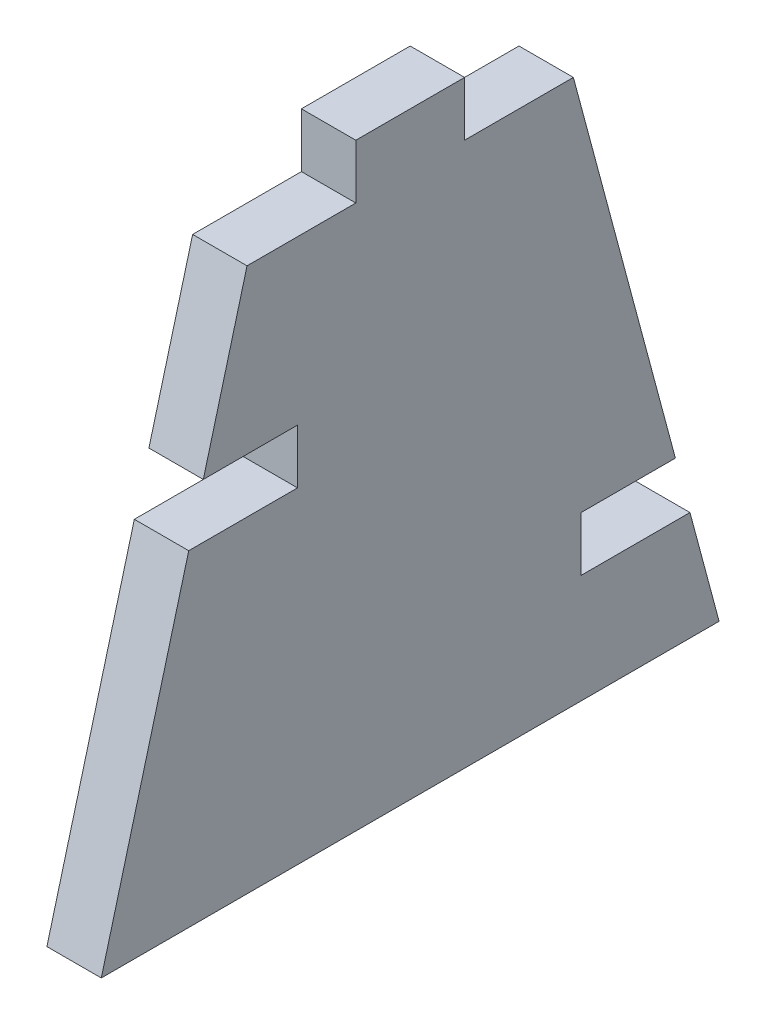
ISO-10303-21;
HEADER;
FILE_DESCRIPTION(('STEP AP214'),'2;1');
FILE_NAME('part.step','',(''),(''),'','','');
FILE_SCHEMA(('AUTOMOTIVE_DESIGN { 1 0 10303 214 1 1 1 1 }'));
ENDSEC;
DATA;
#1=APPLICATION_CONTEXT('core data for automotive mechanical design processes');
#2=APPLICATION_PROTOCOL_DEFINITION('international standard','automotive_design',2000,#1);
#3=PRODUCT_CONTEXT('',#1,'mechanical');
#4=PRODUCT('Part','Part','',(#3));
#5=PRODUCT_RELATED_PRODUCT_CATEGORY('part','',(#4));
#6=PRODUCT_DEFINITION_FORMATION('','',#4);
#7=PRODUCT_DEFINITION_CONTEXT('part definition',#1,'design');
#8=PRODUCT_DEFINITION('design','',#6,#7);
#9=PRODUCT_DEFINITION_SHAPE('','',#8);
#10=(LENGTH_UNIT() NAMED_UNIT(*) SI_UNIT(.MILLI.,.METRE.));
#11=(NAMED_UNIT(*) PLANE_ANGLE_UNIT() SI_UNIT($,.RADIAN.));
#12=(NAMED_UNIT(*) SI_UNIT($,.STERADIAN.) SOLID_ANGLE_UNIT());
#13=UNCERTAINTY_MEASURE_WITH_UNIT(LENGTH_MEASURE(1.E-05),#10,'distance_accuracy_value','');
#14=(GEOMETRIC_REPRESENTATION_CONTEXT(3) GLOBAL_UNCERTAINTY_ASSIGNED_CONTEXT((#13)) GLOBAL_UNIT_ASSIGNED_CONTEXT((#10,
#11,#12)) REPRESENTATION_CONTEXT('',''));
#15=CARTESIAN_POINT('',(0.,0.,0.));
#16=DIRECTION('',(0.,0.,1.));
#17=DIRECTION('',(1.,0.,0.));
#18=AXIS2_PLACEMENT_3D('',#15,#16,#17);
#19=CARTESIAN_POINT('',(10.,70.,20.7179676972451));
#20=DIRECTION('',(0.,0.,-1.));
#21=DIRECTION('',(0.,1.,0.));
#22=AXIS2_PLACEMENT_3D('',#19,#20,#21);
#23=PLANE('',#22);
#24=DIRECTION('',(0.,-1.,0.));
#25=VECTOR('',#24,1.);
#26=CARTESIAN_POINT('',(0.,70.,20.7179676972451));
#27=LINE('',#26,#25);
#28=CARTESIAN_POINT('',(0.,70.,20.7179676972451));
#29=VERTEX_POINT('',#28);
#30=CARTESIAN_POINT('',(0.,60.,20.7179676972451));
#31=VERTEX_POINT('',#30);
#32=EDGE_CURVE('E175',#29,#31,#27,.T.);
#33=ORIENTED_EDGE('',*,*,#32,.T.);
#34=DIRECTION('',(-1.,0.,0.));
#35=VECTOR('',#34,1.);
#36=CARTESIAN_POINT('',(10.,60.,20.7179676972451));
#37=LINE('',#36,#35);
#38=CARTESIAN_POINT('',(10.,60.,20.7179676972451));
#39=VERTEX_POINT('',#38);
#40=EDGE_CURVE('E11',#39,#31,#37,.T.);
#41=ORIENTED_EDGE('',*,*,#40,.F.);
#42=DIRECTION('',(0.,-1.,0.));
#43=VECTOR('',#42,1.);
#44=CARTESIAN_POINT('',(10.,70.,20.7179676972451));
#45=LINE('',#44,#43);
#46=CARTESIAN_POINT('',(10.,70.,20.7179676972451));
#47=VERTEX_POINT('',#46);
#48=EDGE_CURVE('E216',#47,#39,#45,.T.);
#49=ORIENTED_EDGE('',*,*,#48,.F.);
#50=DIRECTION('',(-1.,0.,0.));
#51=VECTOR('',#50,1.);
#52=CARTESIAN_POINT('',(10.,70.,20.7179676972451));
#53=LINE('',#52,#51);
#54=EDGE_CURVE('E171',#47,#29,#53,.T.);
#55=ORIENTED_EDGE('',*,*,#54,.T.);
#56=EDGE_LOOP('',(#33,#41,#49,#55));
#57=FACE_BOUND('',#56,.T.);
#58=ADVANCED_FACE('F32',(#57),#23,.F.);
#59=CARTESIAN_POINT('',(10.,60.,20.7179676972451));
#60=DIRECTION('',(0.,-1.,0.));
#61=DIRECTION('',(0.,0.,-1.));
#62=AXIS2_PLACEMENT_3D('',#59,#60,#61);
#63=PLANE('',#62);
#64=DIRECTION('',(0.,0.,1.));
#65=VECTOR('',#64,1.);
#66=CARTESIAN_POINT('',(0.,60.,20.7179676972451));
#67=LINE('',#66,#65);
#68=CARTESIAN_POINT('',(0.,60.,40.7179676972451));
#69=VERTEX_POINT('',#68);
#70=EDGE_CURVE('E178',#31,#69,#67,.T.);
#71=ORIENTED_EDGE('',*,*,#70,.T.);
#72=DIRECTION('',(-1.,0.,0.));
#73=VECTOR('',#72,1.);
#74=CARTESIAN_POINT('',(10.,60.,40.7179676972451));
#75=LINE('',#74,#73);
#76=CARTESIAN_POINT('',(10.,60.,40.7179676972451));
#77=VERTEX_POINT('',#76);
#78=EDGE_CURVE('E40',#77,#69,#75,.T.);
#79=ORIENTED_EDGE('',*,*,#78,.F.);
#80=DIRECTION('',(0.,0.,1.));
#81=VECTOR('',#80,1.);
#82=CARTESIAN_POINT('',(10.,60.,20.7179676972451));
#83=LINE('',#82,#81);
#84=EDGE_CURVE('E111',#39,#77,#83,.T.);
#85=ORIENTED_EDGE('',*,*,#84,.F.);
#86=ORIENTED_EDGE('',*,*,#40,.T.);
#87=EDGE_LOOP('',(#71,#79,#85,#86));
#88=FACE_BOUND('',#87,.T.);
#89=ADVANCED_FACE('F248',(#88),#63,.F.);
#90=CARTESIAN_POINT('',(10.,0.,56.7949192431127));
#91=DIRECTION('',(0.,0.258819045102525,0.965925826289067));
#92=DIRECTION('',(0.,-0.965925826289067,0.258819045102525));
#93=AXIS2_PLACEMENT_3D('',#90,#91,#92);
#94=PLANE('',#93);
#95=DIRECTION('',(0.,0.965925826289067,-0.258819045102525));
#96=VECTOR('',#95,1.);
#97=CARTESIAN_POINT('',(0.,0.,56.7949192431127));
#98=LINE('',#97,#96);
#99=CARTESIAN_POINT('',(0.,0.,56.7949192431127));
#100=VERTEX_POINT('',#99);
#101=EDGE_CURVE('E181',#100,#69,#98,.T.);
#102=ORIENTED_EDGE('',*,*,#101,.F.);
#103=DIRECTION('',(-1.,0.,0.));
#104=VECTOR('',#103,1.);
#105=CARTESIAN_POINT('',(10.,0.,56.7949192431127));
#106=LINE('',#105,#104);
#107=CARTESIAN_POINT('',(10.,0.,56.7949192431127));
#108=VERTEX_POINT('',#107);
#109=EDGE_CURVE('E241',#108,#100,#106,.T.);
#110=ORIENTED_EDGE('',*,*,#109,.F.);
#111=DIRECTION('',(0.,0.965925826289067,-0.258819045102525));
#112=VECTOR('',#111,1.);
#113=CARTESIAN_POINT('',(10.,0.,56.7949192431127));
#114=LINE('',#113,#112);
#115=EDGE_CURVE('E247',#108,#77,#114,.T.);
#116=ORIENTED_EDGE('',*,*,#115,.T.);
#117=ORIENTED_EDGE('',*,*,#78,.T.);
#118=EDGE_LOOP('',(#102,#110,#116,#117));
#119=FACE_BOUND('',#118,.T.);
#120=ADVANCED_FACE('F245',(#119),#94,.T.);
#121=CARTESIAN_POINT('',(10.,0.,-56.7949192431127));
#122=DIRECTION('',(0.,-1.,0.));
#123=DIRECTION('',(0.,0.,-1.));
#124=AXIS2_PLACEMENT_3D('',#121,#122,#123);
#125=PLANE('',#124);
#126=DIRECTION('',(0.,0.,1.));
#127=VECTOR('',#126,1.);
#128=CARTESIAN_POINT('',(0.,0.,-56.7949192431127));
#129=LINE('',#128,#127);
#130=CARTESIAN_POINT('',(0.,0.,-56.7949192431127));
#131=VERTEX_POINT('',#130);
#132=EDGE_CURVE('E184',#131,#100,#129,.T.);
#133=ORIENTED_EDGE('',*,*,#132,.F.);
#134=DIRECTION('',(-1.,0.,0.));
#135=VECTOR('',#134,1.);
#136=CARTESIAN_POINT('',(10.,0.,-56.7949192431127));
#137=LINE('',#136,#135);
#138=CARTESIAN_POINT('',(10.,0.,-56.7949192431127));
#139=VERTEX_POINT('',#138);
#140=EDGE_CURVE('E239',#139,#131,#137,.T.);
#141=ORIENTED_EDGE('',*,*,#140,.F.);
#142=DIRECTION('',(0.,0.,1.));
#143=VECTOR('',#142,1.);
#144=CARTESIAN_POINT('',(10.,0.,-56.7949192431127));
#145=LINE('',#144,#143);
#146=EDGE_CURVE('E260',#139,#108,#145,.T.);
#147=ORIENTED_EDGE('',*,*,#146,.T.);
#148=ORIENTED_EDGE('',*,*,#109,.T.);
#149=EDGE_LOOP('',(#133,#141,#147,#148));
#150=FACE_BOUND('',#149,.T.);
#151=ADVANCED_FACE('F256',(#150),#125,.T.);
#152=CARTESIAN_POINT('',(10.,0.,-56.7949192431127));
#153=DIRECTION('',(0.,-0.258819045102525,0.965925826289067));
#154=DIRECTION('',(0.,-0.965925826289067,-0.258819045102525));
#155=AXIS2_PLACEMENT_3D('',#152,#153,#154);
#156=PLANE('',#155);
#157=DIRECTION('',(0.,0.965925826289067,0.258819045102525));
#158=VECTOR('',#157,1.);
#159=CARTESIAN_POINT('',(0.,0.,-56.7949192431127));
#160=LINE('',#159,#158);
#161=CARTESIAN_POINT('',(0.,20.,-51.4359353944902));
#162=VERTEX_POINT('',#161);
#163=EDGE_CURVE('E187',#131,#162,#160,.T.);
#164=ORIENTED_EDGE('',*,*,#163,.T.);
#165=DIRECTION('',(-1.,0.,0.));
#166=VECTOR('',#165,1.);
#167=CARTESIAN_POINT('',(10.,20.,-51.4359353944902));
#168=LINE('',#167,#166);
#169=CARTESIAN_POINT('',(10.,20.,-51.4359353944902));
#170=VERTEX_POINT('',#169);
#171=EDGE_CURVE('E237',#170,#162,#168,.T.);
#172=ORIENTED_EDGE('',*,*,#171,.F.);
#173=DIRECTION('',(0.,0.965925826289067,0.258819045102525));
#174=VECTOR('',#173,1.);
#175=CARTESIAN_POINT('',(10.,0.,-56.7949192431127));
#176=LINE('',#175,#174);
#177=EDGE_CURVE('E262',#139,#170,#176,.T.);
#178=ORIENTED_EDGE('',*,*,#177,.F.);
#179=ORIENTED_EDGE('',*,*,#140,.T.);
#180=EDGE_LOOP('',(#164,#172,#178,#179));
#181=FACE_BOUND('',#180,.T.);
#182=ADVANCED_FACE('F312',(#181),#156,.F.);
#183=CARTESIAN_POINT('',(10.,20.,-31.4359353944902));
#184=DIRECTION('',(0.,1.,0.));
#185=DIRECTION('',(0.,0.,1.));
#186=AXIS2_PLACEMENT_3D('',#183,#184,#185);
#187=PLANE('',#186);
#188=DIRECTION('',(0.,0.,-1.));
#189=VECTOR('',#188,1.);
#190=CARTESIAN_POINT('',(0.,20.,-31.4359353944902));
#191=LINE('',#190,#189);
#192=CARTESIAN_POINT('',(0.,20.,-31.4359353944902));
#193=VERTEX_POINT('',#192);
#194=EDGE_CURVE('E190',#193,#162,#191,.T.);
#195=ORIENTED_EDGE('',*,*,#194,.F.);
#196=DIRECTION('',(-1.,0.,0.));
#197=VECTOR('',#196,1.);
#198=CARTESIAN_POINT('',(10.,20.,-31.4359353944902));
#199=LINE('',#198,#197);
#200=CARTESIAN_POINT('',(10.,20.,-31.4359353944902));
#201=VERTEX_POINT('',#200);
#202=EDGE_CURVE('E235',#201,#193,#199,.T.);
#203=ORIENTED_EDGE('',*,*,#202,.F.);
#204=DIRECTION('',(0.,0.,-1.));
#205=VECTOR('',#204,1.);
#206=CARTESIAN_POINT('',(10.,20.,-31.4359353944902));
#207=LINE('',#206,#205);
#208=EDGE_CURVE('E268',#201,#170,#207,.T.);
#209=ORIENTED_EDGE('',*,*,#208,.T.);
#210=ORIENTED_EDGE('',*,*,#171,.T.);
#211=EDGE_LOOP('',(#195,#203,#209,#210));
#212=FACE_BOUND('',#211,.T.);
#213=ADVANCED_FACE('F315',(#212),#187,.T.);
#214=CARTESIAN_POINT('',(10.,30.,-31.4359353944902));
#215=DIRECTION('',(0.,0.,-1.));
#216=DIRECTION('',(-1.,0.,0.));
#217=AXIS2_PLACEMENT_3D('',#214,#215,#216);
#218=PLANE('',#217);
#219=DIRECTION('',(0.,-1.,0.));
#220=VECTOR('',#219,1.);
#221=CARTESIAN_POINT('',(0.,30.,-31.4359353944902));
#222=LINE('',#221,#220);
#223=CARTESIAN_POINT('',(0.,30.,-31.4359353944902));
#224=VERTEX_POINT('',#223);
#225=EDGE_CURVE('E193',#224,#193,#222,.T.);
#226=ORIENTED_EDGE('',*,*,#225,.F.);
#227=DIRECTION('',(-1.,0.,0.));
#228=VECTOR('',#227,1.);
#229=CARTESIAN_POINT('',(10.,30.,-31.4359353944902));
#230=LINE('',#229,#228);
#231=CARTESIAN_POINT('',(10.,30.,-31.4359353944902));
#232=VERTEX_POINT('',#231);
#233=EDGE_CURVE('E233',#232,#224,#230,.T.);
#234=ORIENTED_EDGE('',*,*,#233,.F.);
#235=DIRECTION('',(0.,-1.,0.));
#236=VECTOR('',#235,1.);
#237=CARTESIAN_POINT('',(10.,30.,-31.4359353944902));
#238=LINE('',#237,#236);
#239=EDGE_CURVE('E271',#232,#201,#238,.T.);
#240=ORIENTED_EDGE('',*,*,#239,.T.);
#241=ORIENTED_EDGE('',*,*,#202,.T.);
#242=EDGE_LOOP('',(#226,#234,#240,#241));
#243=FACE_BOUND('',#242,.T.);
#244=ADVANCED_FACE('F319',(#243),#218,.T.);
#245=CARTESIAN_POINT('',(10.,30.,-48.7564434701789));
#246=DIRECTION('',(0.,-1.,0.));
#247=DIRECTION('',(0.,0.,-1.));
#248=AXIS2_PLACEMENT_3D('',#245,#246,#247);
#249=PLANE('',#248);
#250=DIRECTION('',(0.,0.,1.));
#251=VECTOR('',#250,1.);
#252=CARTESIAN_POINT('',(0.,30.,-48.7564434701789));
#253=LINE('',#252,#251);
#254=CARTESIAN_POINT('',(0.,30.,-48.7564434701789));
#255=VERTEX_POINT('',#254);
#256=EDGE_CURVE('E196',#255,#224,#253,.T.);
#257=ORIENTED_EDGE('',*,*,#256,.F.);
#258=DIRECTION('',(-1.,0.,0.));
#259=VECTOR('',#258,1.);
#260=CARTESIAN_POINT('',(10.,30.,-48.7564434701789));
#261=LINE('',#260,#259);
#262=CARTESIAN_POINT('',(10.,30.,-48.7564434701789));
#263=VERTEX_POINT('',#262);
#264=EDGE_CURVE('E230',#263,#255,#261,.T.);
#265=ORIENTED_EDGE('',*,*,#264,.F.);
#266=DIRECTION('',(0.,0.,1.));
#267=VECTOR('',#266,1.);
#268=CARTESIAN_POINT('',(10.,30.,-48.7564434701789));
#269=LINE('',#268,#267);
#270=EDGE_CURVE('E274',#263,#232,#269,.T.);
#271=ORIENTED_EDGE('',*,*,#270,.T.);
#272=ORIENTED_EDGE('',*,*,#233,.T.);
#273=EDGE_LOOP('',(#257,#265,#271,#272));
#274=FACE_BOUND('',#273,.T.);
#275=ADVANCED_FACE('F323',(#274),#249,.T.);
#276=CARTESIAN_POINT('',(10.,70.,-38.0384757729338));
#277=DIRECTION('',(0.,-0.258819045102525,0.965925826289067));
#278=DIRECTION('',(0.,-0.965925826289067,-0.258819045102525));
#279=AXIS2_PLACEMENT_3D('',#276,#277,#278);
#280=PLANE('',#279);
#281=DIRECTION('',(0.,0.965925826289067,0.258819045102525));
#282=VECTOR('',#281,1.);
#283=CARTESIAN_POINT('',(0.,70.,-38.0384757729338));
#284=LINE('',#283,#282);
#285=CARTESIAN_POINT('',(0.,100.,-30.));
#286=VERTEX_POINT('',#285);
#287=EDGE_CURVE('E199',#255,#286,#284,.T.);
#288=ORIENTED_EDGE('',*,*,#287,.T.);
#289=DIRECTION('',(-1.,0.,0.));
#290=VECTOR('',#289,1.);
#291=CARTESIAN_POINT('',(10.,100.,-30.));
#292=LINE('',#291,#290);
#293=CARTESIAN_POINT('',(10.,100.,-30.));
#294=VERTEX_POINT('',#293);
#295=EDGE_CURVE('E227',#294,#286,#292,.T.);
#296=ORIENTED_EDGE('',*,*,#295,.F.);
#297=DIRECTION('',(0.,0.965925826289067,0.258819045102525));
#298=VECTOR('',#297,1.);
#299=CARTESIAN_POINT('',(10.,30.,-48.7564434701789));
#300=LINE('',#299,#298);
#301=EDGE_CURVE('E277',#263,#294,#300,.T.);
#302=ORIENTED_EDGE('',*,*,#301,.F.);
#303=ORIENTED_EDGE('',*,*,#264,.T.);
#304=EDGE_LOOP('',(#288,#296,#302,#303));
#305=FACE_BOUND('',#304,.T.);
#306=ADVANCED_FACE('F327',(#305),#280,.F.);
#307=CARTESIAN_POINT('',(10.,100.,-30.));
#308=DIRECTION('',(0.,-1.,0.));
#309=DIRECTION('',(0.,0.,-1.));
#310=AXIS2_PLACEMENT_3D('',#307,#308,#309);
#311=PLANE('',#310);
#312=DIRECTION('',(0.,0.,1.));
#313=VECTOR('',#312,1.);
#314=CARTESIAN_POINT('',(0.,100.,-30.));
#315=LINE('',#314,#313);
#316=CARTESIAN_POINT('',(0.,100.,-10.));
#317=VERTEX_POINT('',#316);
#318=EDGE_CURVE('E201',#286,#317,#315,.T.);
#319=ORIENTED_EDGE('',*,*,#318,.T.);
#320=DIRECTION('',(-1.,0.,0.));
#321=VECTOR('',#320,1.);
#322=CARTESIAN_POINT('',(10.,100.,-10.));
#323=LINE('',#322,#321);
#324=CARTESIAN_POINT('',(10.,100.,-10.));
#325=VERTEX_POINT('',#324);
#326=EDGE_CURVE('E224',#325,#317,#323,.T.);
#327=ORIENTED_EDGE('',*,*,#326,.F.);
#328=DIRECTION('',(0.,0.,1.));
#329=VECTOR('',#328,1.);
#330=CARTESIAN_POINT('',(10.,100.,-30.));
#331=LINE('',#330,#329);
#332=EDGE_CURVE('E279',#294,#325,#331,.T.);
#333=ORIENTED_EDGE('',*,*,#332,.F.);
#334=ORIENTED_EDGE('',*,*,#295,.T.);
#335=EDGE_LOOP('',(#319,#327,#333,#334));
#336=FACE_BOUND('',#335,.T.);
#337=ADVANCED_FACE('F331',(#336),#311,.F.);
#338=CARTESIAN_POINT('',(10.,100.,-10.));
#339=DIRECTION('',(0.,0.,1.));
#340=DIRECTION('',(0.,-1.,0.));
#341=AXIS2_PLACEMENT_3D('',#338,#339,#340);
#342=PLANE('',#341);
#343=DIRECTION('',(0.,1.,0.));
#344=VECTOR('',#343,1.);
#345=CARTESIAN_POINT('',(0.,100.,-10.));
#346=LINE('',#345,#344);
#347=CARTESIAN_POINT('',(0.,110.,-10.));
#348=VERTEX_POINT('',#347);
#349=EDGE_CURVE('E203',#317,#348,#346,.T.);
#350=ORIENTED_EDGE('',*,*,#349,.T.);
#351=DIRECTION('',(-1.,0.,0.));
#352=VECTOR('',#351,1.);
#353=CARTESIAN_POINT('',(10.,110.,-10.));
#354=LINE('',#353,#352);
#355=CARTESIAN_POINT('',(10.,110.,-10.));
#356=VERTEX_POINT('',#355);
#357=EDGE_CURVE('E222',#356,#348,#354,.T.);
#358=ORIENTED_EDGE('',*,*,#357,.F.);
#359=DIRECTION('',(0.,1.,0.));
#360=VECTOR('',#359,1.);
#361=CARTESIAN_POINT('',(10.,100.,-10.));
#362=LINE('',#361,#360);
#363=EDGE_CURVE('E281',#325,#356,#362,.T.);
#364=ORIENTED_EDGE('',*,*,#363,.F.);
#365=ORIENTED_EDGE('',*,*,#326,.T.);
#366=EDGE_LOOP('',(#350,#358,#364,#365));
#367=FACE_BOUND('',#366,.T.);
#368=ADVANCED_FACE('F335',(#367),#342,.F.);
#369=CARTESIAN_POINT('',(10.,110.,10.));
#370=DIRECTION('',(0.,1.,0.));
#371=DIRECTION('',(0.,0.,1.));
#372=AXIS2_PLACEMENT_3D('',#369,#370,#371);
#373=PLANE('',#372);
#374=DIRECTION('',(0.,0.,-1.));
#375=VECTOR('',#374,1.);
#376=CARTESIAN_POINT('',(0.,110.,10.));
#377=LINE('',#376,#375);
#378=CARTESIAN_POINT('',(0.,110.,10.));
#379=VERTEX_POINT('',#378);
#380=EDGE_CURVE('E206',#379,#348,#377,.T.);
#381=ORIENTED_EDGE('',*,*,#380,.F.);
#382=DIRECTION('',(-1.,0.,0.));
#383=VECTOR('',#382,1.);
#384=CARTESIAN_POINT('',(10.,110.,10.));
#385=LINE('',#384,#383);
#386=CARTESIAN_POINT('',(10.,110.,10.));
#387=VERTEX_POINT('',#386);
#388=EDGE_CURVE('E220',#387,#379,#385,.T.);
#389=ORIENTED_EDGE('',*,*,#388,.F.);
#390=DIRECTION('',(0.,0.,-1.));
#391=VECTOR('',#390,1.);
#392=CARTESIAN_POINT('',(10.,110.,10.));
#393=LINE('',#392,#391);
#394=EDGE_CURVE('E283',#387,#356,#393,.T.);
#395=ORIENTED_EDGE('',*,*,#394,.T.);
#396=ORIENTED_EDGE('',*,*,#357,.T.);
#397=EDGE_LOOP('',(#381,#389,#395,#396));
#398=FACE_BOUND('',#397,.T.);
#399=ADVANCED_FACE('F339',(#398),#373,.T.);
#400=CARTESIAN_POINT('',(10.,100.,10.));
#401=DIRECTION('',(0.,0.,1.));
#402=DIRECTION('',(0.,-1.,0.));
#403=AXIS2_PLACEMENT_3D('',#400,#401,#402);
#404=PLANE('',#403);
#405=DIRECTION('',(0.,1.,0.));
#406=VECTOR('',#405,1.);
#407=CARTESIAN_POINT('',(0.,100.,10.));
#408=LINE('',#407,#406);
#409=CARTESIAN_POINT('',(0.,100.,10.));
#410=VERTEX_POINT('',#409);
#411=EDGE_CURVE('E209',#410,#379,#408,.T.);
#412=ORIENTED_EDGE('',*,*,#411,.F.);
#413=DIRECTION('',(-1.,0.,0.));
#414=VECTOR('',#413,1.);
#415=CARTESIAN_POINT('',(10.,100.,10.));
#416=LINE('',#415,#414);
#417=CARTESIAN_POINT('',(10.,100.,10.));
#418=VERTEX_POINT('',#417);
#419=EDGE_CURVE('E160',#418,#410,#416,.T.);
#420=ORIENTED_EDGE('',*,*,#419,.F.);
#421=DIRECTION('',(0.,1.,0.));
#422=VECTOR('',#421,1.);
#423=CARTESIAN_POINT('',(10.,100.,10.));
#424=LINE('',#423,#422);
#425=EDGE_CURVE('E167',#418,#387,#424,.T.);
#426=ORIENTED_EDGE('',*,*,#425,.T.);
#427=ORIENTED_EDGE('',*,*,#388,.T.);
#428=EDGE_LOOP('',(#412,#420,#426,#427));
#429=FACE_BOUND('',#428,.T.);
#430=ADVANCED_FACE('F287',(#429),#404,.T.);
#431=CARTESIAN_POINT('',(10.,100.,30.));
#432=DIRECTION('',(0.,1.,0.));
#433=DIRECTION('',(0.,0.,1.));
#434=AXIS2_PLACEMENT_3D('',#431,#432,#433);
#435=PLANE('',#434);
#436=DIRECTION('',(0.,0.,-1.));
#437=VECTOR('',#436,1.);
#438=CARTESIAN_POINT('',(0.,100.,30.));
#439=LINE('',#438,#437);
#440=CARTESIAN_POINT('',(0.,100.,30.));
#441=VERTEX_POINT('',#440);
#442=EDGE_CURVE('E155',#441,#410,#439,.T.);
#443=ORIENTED_EDGE('',*,*,#442,.F.);
#444=DIRECTION('',(-1.,0.,0.));
#445=VECTOR('',#444,1.);
#446=CARTESIAN_POINT('',(10.,100.,30.));
#447=LINE('',#446,#445);
#448=CARTESIAN_POINT('',(10.,100.,30.));
#449=VERTEX_POINT('',#448);
#450=EDGE_CURVE('E150',#449,#441,#447,.T.);
#451=ORIENTED_EDGE('',*,*,#450,.F.);
#452=DIRECTION('',(0.,0.,-1.));
#453=VECTOR('',#452,1.);
#454=CARTESIAN_POINT('',(10.,100.,30.));
#455=LINE('',#454,#453);
#456=EDGE_CURVE('E153',#449,#418,#455,.T.);
#457=ORIENTED_EDGE('',*,*,#456,.T.);
#458=ORIENTED_EDGE('',*,*,#419,.T.);
#459=EDGE_LOOP('',(#443,#451,#457,#458));
#460=FACE_BOUND('',#459,.T.);
#461=ADVANCED_FACE('F152',(#460),#435,.T.);
#462=CARTESIAN_POINT('',(10.,70.,38.0384757729338));
#463=DIRECTION('',(0.,0.258819045102525,0.965925826289067));
#464=DIRECTION('',(0.,-0.965925826289067,0.258819045102525));
#465=AXIS2_PLACEMENT_3D('',#462,#463,#464);
#466=PLANE('',#465);
#467=DIRECTION('',(0.,0.965925826289067,-0.258819045102525));
#468=VECTOR('',#467,1.);
#469=CARTESIAN_POINT('',(0.,70.,38.0384757729338));
#470=LINE('',#469,#468);
#471=CARTESIAN_POINT('',(0.,70.,38.0384757729338));
#472=VERTEX_POINT('',#471);
#473=EDGE_CURVE('E213',#472,#441,#470,.T.);
#474=ORIENTED_EDGE('',*,*,#473,.F.);
#475=DIRECTION('',(-1.,0.,0.));
#476=VECTOR('',#475,1.);
#477=CARTESIAN_POINT('',(10.,70.,38.0384757729338));
#478=LINE('',#477,#476);
#479=CARTESIAN_POINT('',(10.,70.,38.0384757729338));
#480=VERTEX_POINT('',#479);
#481=EDGE_CURVE('E100',#480,#472,#478,.T.);
#482=ORIENTED_EDGE('',*,*,#481,.F.);
#483=DIRECTION('',(0.,0.965925826289067,-0.258819045102525));
#484=VECTOR('',#483,1.);
#485=CARTESIAN_POINT('',(10.,70.,38.0384757729338));
#486=LINE('',#485,#484);
#487=EDGE_CURVE('E164',#480,#449,#486,.T.);
#488=ORIENTED_EDGE('',*,*,#487,.T.);
#489=ORIENTED_EDGE('',*,*,#450,.T.);
#490=EDGE_LOOP('',(#474,#482,#488,#489));
#491=FACE_BOUND('',#490,.T.);
#492=ADVANCED_FACE('F169',(#491),#466,.T.);
#493=CARTESIAN_POINT('',(10.,70.,38.0384757729338));
#494=DIRECTION('',(0.,1.,0.));
#495=DIRECTION('',(0.,0.,1.));
#496=AXIS2_PLACEMENT_3D('',#493,#494,#495);
#497=PLANE('',#496);
#498=DIRECTION('',(0.,0.,-1.));
#499=VECTOR('',#498,1.);
#500=CARTESIAN_POINT('',(0.,70.,38.0384757729338));
#501=LINE('',#500,#499);
#502=EDGE_CURVE('E103',#472,#29,#501,.T.);
#503=ORIENTED_EDGE('',*,*,#502,.T.);
#504=ORIENTED_EDGE('',*,*,#54,.F.);
#505=DIRECTION('',(0.,0.,-1.));
#506=VECTOR('',#505,1.);
#507=CARTESIAN_POINT('',(10.,70.,38.0384757729338));
#508=LINE('',#507,#506);
#509=EDGE_CURVE('E48',#480,#47,#508,.T.);
#510=ORIENTED_EDGE('',*,*,#509,.F.);
#511=ORIENTED_EDGE('',*,*,#481,.T.);
#512=EDGE_LOOP('',(#503,#504,#510,#511));
#513=FACE_BOUND('',#512,.T.);
#514=ADVANCED_FACE('F291',(#513),#497,.F.);
#515=CARTESIAN_POINT('',(10.,0.,0.));
#516=DIRECTION('',(-1.,0.,0.));
#517=DIRECTION('',(0.,0.,1.));
#518=AXIS2_PLACEMENT_3D('',#515,#516,#517);
#519=PLANE('',#518);
#520=ORIENTED_EDGE('',*,*,#48,.T.);
#521=ORIENTED_EDGE('',*,*,#84,.T.);
#522=ORIENTED_EDGE('',*,*,#115,.F.);
#523=ORIENTED_EDGE('',*,*,#146,.F.);
#524=ORIENTED_EDGE('',*,*,#177,.T.);
#525=ORIENTED_EDGE('',*,*,#208,.F.);
#526=ORIENTED_EDGE('',*,*,#239,.F.);
#527=ORIENTED_EDGE('',*,*,#270,.F.);
#528=ORIENTED_EDGE('',*,*,#301,.T.);
#529=ORIENTED_EDGE('',*,*,#332,.T.);
#530=ORIENTED_EDGE('',*,*,#363,.T.);
#531=ORIENTED_EDGE('',*,*,#394,.F.);
#532=ORIENTED_EDGE('',*,*,#425,.F.);
#533=ORIENTED_EDGE('',*,*,#456,.F.);
#534=ORIENTED_EDGE('',*,*,#487,.F.);
#535=ORIENTED_EDGE('',*,*,#509,.T.);
#536=EDGE_LOOP('',(#520,#521,#522,#523,#524,#525,#526,#527,#528,#529,#530,#531,#532,#533,#534,#535));
#537=FACE_BOUND('',#536,.T.);
#538=ADVANCED_FACE('F163',(#537),#519,.F.);
#539=CARTESIAN_POINT('',(0.,0.,0.));
#540=DIRECTION('',(-1.,0.,0.));
#541=DIRECTION('',(0.,0.,1.));
#542=AXIS2_PLACEMENT_3D('',#539,#540,#541);
#543=PLANE('',#542);
#544=ORIENTED_EDGE('',*,*,#32,.F.);
#545=ORIENTED_EDGE('',*,*,#502,.F.);
#546=ORIENTED_EDGE('',*,*,#473,.T.);
#547=ORIENTED_EDGE('',*,*,#442,.T.);
#548=ORIENTED_EDGE('',*,*,#411,.T.);
#549=ORIENTED_EDGE('',*,*,#380,.T.);
#550=ORIENTED_EDGE('',*,*,#349,.F.);
#551=ORIENTED_EDGE('',*,*,#318,.F.);
#552=ORIENTED_EDGE('',*,*,#287,.F.);
#553=ORIENTED_EDGE('',*,*,#256,.T.);
#554=ORIENTED_EDGE('',*,*,#225,.T.);
#555=ORIENTED_EDGE('',*,*,#194,.T.);
#556=ORIENTED_EDGE('',*,*,#163,.F.);
#557=ORIENTED_EDGE('',*,*,#132,.T.);
#558=ORIENTED_EDGE('',*,*,#101,.T.);
#559=ORIENTED_EDGE('',*,*,#70,.F.);
#560=EDGE_LOOP('',(#544,#545,#546,#547,#548,#549,#550,#551,#552,#553,#554,#555,#556,#557,#558,#559));
#561=FACE_BOUND('',#560,.T.);
#562=ADVANCED_FACE('F252',(#561),#543,.T.);
#563=CLOSED_SHELL('',(#58,#89,#120,#151,#182,#213,#244,#275,#306,#337,#368,#399,#430,#461,#492,
#514,#538,#562));
#564=MANIFOLD_SOLID_BREP('B2',#563);
#565=ADVANCED_BREP_SHAPE_REPRESENTATION('',(#18,#564),#14);
#566=SHAPE_DEFINITION_REPRESENTATION(#9,#565);
ENDSEC;
END-ISO-10303-21;
